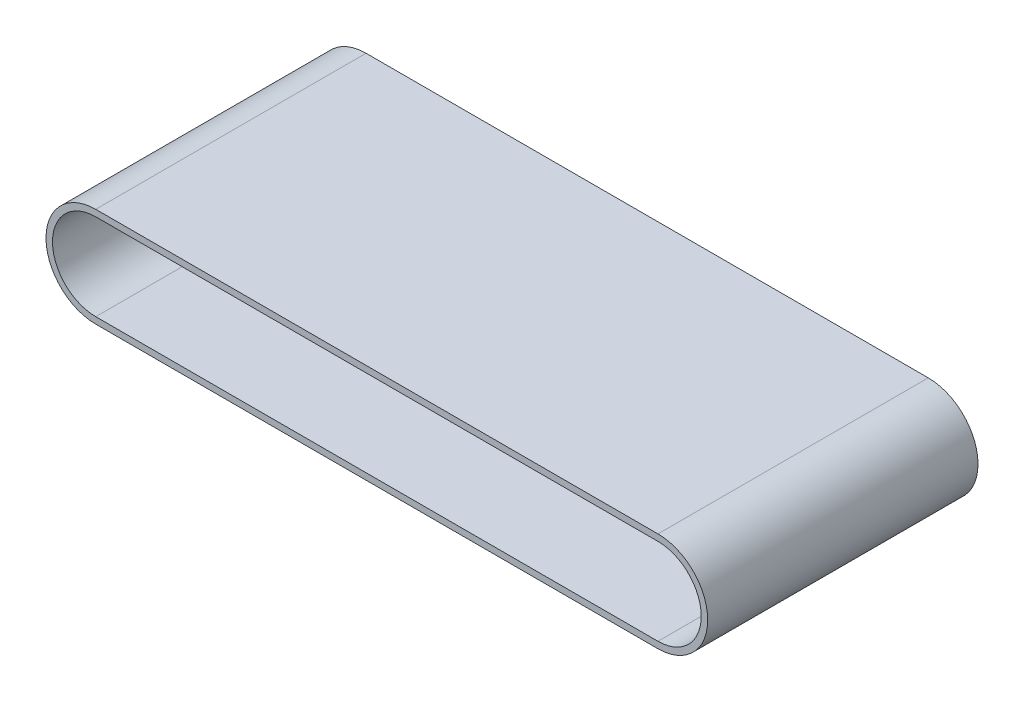
ISO-10303-21;
HEADER;
FILE_DESCRIPTION(('STEP AP214'),'2;1');
FILE_NAME('part.step','',(''),(''),'','','');
FILE_SCHEMA(('AUTOMOTIVE_DESIGN { 1 0 10303 214 1 1 1 1 }'));
ENDSEC;
DATA;
#1=APPLICATION_CONTEXT('core data for automotive mechanical design processes');
#2=APPLICATION_PROTOCOL_DEFINITION('international standard','automotive_design',2000,#1);
#3=PRODUCT_CONTEXT('',#1,'mechanical');
#4=PRODUCT('Part','Part','',(#3));
#5=PRODUCT_RELATED_PRODUCT_CATEGORY('part','',(#4));
#6=PRODUCT_DEFINITION_FORMATION('','',#4);
#7=PRODUCT_DEFINITION_CONTEXT('part definition',#1,'design');
#8=PRODUCT_DEFINITION('design','',#6,#7);
#9=PRODUCT_DEFINITION_SHAPE('','',#8);
#10=(LENGTH_UNIT() NAMED_UNIT(*) SI_UNIT(.MILLI.,.METRE.));
#11=(NAMED_UNIT(*) PLANE_ANGLE_UNIT() SI_UNIT($,.RADIAN.));
#12=(NAMED_UNIT(*) SI_UNIT($,.STERADIAN.) SOLID_ANGLE_UNIT());
#13=UNCERTAINTY_MEASURE_WITH_UNIT(LENGTH_MEASURE(1.E-05),#10,'distance_accuracy_value','');
#14=(GEOMETRIC_REPRESENTATION_CONTEXT(3) GLOBAL_UNCERTAINTY_ASSIGNED_CONTEXT((#13)) GLOBAL_UNIT_ASSIGNED_CONTEXT((#10,
#11,#12)) REPRESENTATION_CONTEXT('',''));
#15=CARTESIAN_POINT('',(0.,0.,0.));
#16=DIRECTION('',(0.,0.,1.));
#17=DIRECTION('',(1.,0.,0.));
#18=AXIS2_PLACEMENT_3D('',#15,#16,#17);
#19=CARTESIAN_POINT('',(130.,0.,125.));
#20=DIRECTION('',(0.,0.,1.));
#21=DIRECTION('',(1.,0.,0.));
#22=AXIS2_PLACEMENT_3D('',#19,#20,#21);
#23=PLANE('',#22);
#24=CARTESIAN_POINT('',(130.,0.,125.));
#25=DIRECTION('',(0.,0.,1.));
#26=DIRECTION('',(1.,0.,0.));
#27=AXIS2_PLACEMENT_3D('',#24,#25,#26);
#28=CIRCLE('',#27,23.);
#29=CARTESIAN_POINT('',(130.,-23.,125.));
#30=VERTEX_POINT('',#29);
#31=CARTESIAN_POINT('',(130.,23.,125.));
#32=VERTEX_POINT('',#31);
#33=EDGE_CURVE('E176',#30,#32,#28,.T.);
#34=ORIENTED_EDGE('',*,*,#33,.T.);
#35=DIRECTION('',(1.,0.,0.));
#36=VECTOR('',#35,1.);
#37=CARTESIAN_POINT('',(0.,23.,125.));
#38=LINE('',#37,#36);
#39=CARTESIAN_POINT('',(-130.,23.,125.));
#40=VERTEX_POINT('',#39);
#41=EDGE_CURVE('E179',#40,#32,#38,.T.);
#42=ORIENTED_EDGE('',*,*,#41,.F.);
#43=CARTESIAN_POINT('',(-130.,0.,125.));
#44=DIRECTION('',(0.,0.,1.));
#45=DIRECTION('',(1.,0.,0.));
#46=AXIS2_PLACEMENT_3D('',#43,#44,#45);
#47=CIRCLE('',#46,23.);
#48=CARTESIAN_POINT('',(-130.,-23.,125.));
#49=VERTEX_POINT('',#48);
#50=EDGE_CURVE('E184',#40,#49,#47,.T.);
#51=ORIENTED_EDGE('',*,*,#50,.T.);
#52=DIRECTION('',(1.,0.,0.));
#53=VECTOR('',#52,1.);
#54=CARTESIAN_POINT('',(0.,-23.,125.));
#55=LINE('',#54,#53);
#56=EDGE_CURVE('E187',#49,#30,#55,.T.);
#57=ORIENTED_EDGE('',*,*,#56,.T.);
#58=EDGE_LOOP('',(#34,#42,#51,#57));
#59=FACE_BOUND('',#58,.T.);
#60=DIRECTION('',(1.,0.,0.));
#61=VECTOR('',#60,1.);
#62=CARTESIAN_POINT('',(0.,20.,125.));
#63=LINE('',#62,#61);
#64=CARTESIAN_POINT('',(-130.,20.,125.));
#65=VERTEX_POINT('',#64);
#66=CARTESIAN_POINT('',(130.,20.,125.));
#67=VERTEX_POINT('',#66);
#68=EDGE_CURVE('E137',#65,#67,#63,.T.);
#69=ORIENTED_EDGE('',*,*,#68,.T.);
#70=CARTESIAN_POINT('',(130.,0.,125.));
#71=DIRECTION('',(0.,0.,1.));
#72=DIRECTION('',(1.,0.,0.));
#73=AXIS2_PLACEMENT_3D('',#70,#71,#72);
#74=CIRCLE('',#73,20.);
#75=CARTESIAN_POINT('',(130.,-20.,125.));
#76=VERTEX_POINT('',#75);
#77=EDGE_CURVE('E127',#76,#67,#74,.T.);
#78=ORIENTED_EDGE('',*,*,#77,.F.);
#79=DIRECTION('',(1.,0.,0.));
#80=VECTOR('',#79,1.);
#81=CARTESIAN_POINT('',(0.,-20.,125.));
#82=LINE('',#81,#80);
#83=CARTESIAN_POINT('',(-130.,-20.,125.));
#84=VERTEX_POINT('',#83);
#85=EDGE_CURVE('E154',#84,#76,#82,.T.);
#86=ORIENTED_EDGE('',*,*,#85,.F.);
#87=CARTESIAN_POINT('',(-130.,0.,125.));
#88=DIRECTION('',(0.,0.,1.));
#89=DIRECTION('',(1.,0.,0.));
#90=AXIS2_PLACEMENT_3D('',#87,#88,#89);
#91=CIRCLE('',#90,20.);
#92=EDGE_CURVE('E150',#65,#84,#91,.T.);
#93=ORIENTED_EDGE('',*,*,#92,.F.);
#94=EDGE_LOOP('',(#69,#78,#86,#93));
#95=FACE_BOUND('',#94,.T.);
#96=ADVANCED_FACE('F63',(#59,#95),#23,.T.);
#97=CARTESIAN_POINT('',(130.,0.,0.));
#98=DIRECTION('',(0.,0.,1.));
#99=DIRECTION('',(1.,0.,0.));
#100=AXIS2_PLACEMENT_3D('',#97,#98,#99);
#101=PLANE('',#100);
#102=CARTESIAN_POINT('',(130.,0.,0.));
#103=DIRECTION('',(0.,0.,1.));
#104=DIRECTION('',(1.,0.,0.));
#105=AXIS2_PLACEMENT_3D('',#102,#103,#104);
#106=CIRCLE('',#105,23.);
#107=CARTESIAN_POINT('',(130.,-23.,0.));
#108=VERTEX_POINT('',#107);
#109=CARTESIAN_POINT('',(130.,23.,0.));
#110=VERTEX_POINT('',#109);
#111=EDGE_CURVE('E147',#108,#110,#106,.T.);
#112=ORIENTED_EDGE('',*,*,#111,.F.);
#113=DIRECTION('',(1.,0.,0.));
#114=VECTOR('',#113,1.);
#115=CARTESIAN_POINT('',(0.,-23.,0.));
#116=LINE('',#115,#114);
#117=CARTESIAN_POINT('',(-130.,-23.,0.));
#118=VERTEX_POINT('',#117);
#119=EDGE_CURVE('E180',#118,#108,#116,.T.);
#120=ORIENTED_EDGE('',*,*,#119,.F.);
#121=CARTESIAN_POINT('',(-130.,0.,0.));
#122=DIRECTION('',(0.,0.,1.));
#123=DIRECTION('',(1.,0.,0.));
#124=AXIS2_PLACEMENT_3D('',#121,#122,#123);
#125=CIRCLE('',#124,23.);
#126=CARTESIAN_POINT('',(-130.,23.,0.));
#127=VERTEX_POINT('',#126);
#128=EDGE_CURVE('E198',#127,#118,#125,.T.);
#129=ORIENTED_EDGE('',*,*,#128,.F.);
#130=DIRECTION('',(1.,0.,0.));
#131=VECTOR('',#130,1.);
#132=CARTESIAN_POINT('',(0.,23.,0.));
#133=LINE('',#132,#131);
#134=EDGE_CURVE('E194',#127,#110,#133,.T.);
#135=ORIENTED_EDGE('',*,*,#134,.T.);
#136=EDGE_LOOP('',(#112,#120,#129,#135));
#137=FACE_BOUND('',#136,.T.);
#138=CARTESIAN_POINT('',(130.,0.,0.));
#139=DIRECTION('',(0.,0.,1.));
#140=DIRECTION('',(1.,0.,0.));
#141=AXIS2_PLACEMENT_3D('',#138,#139,#140);
#142=CIRCLE('',#141,20.);
#143=CARTESIAN_POINT('',(130.,-20.,0.));
#144=VERTEX_POINT('',#143);
#145=CARTESIAN_POINT('',(130.,20.,0.));
#146=VERTEX_POINT('',#145);
#147=EDGE_CURVE('E87',#144,#146,#142,.T.);
#148=ORIENTED_EDGE('',*,*,#147,.T.);
#149=DIRECTION('',(1.,0.,0.));
#150=VECTOR('',#149,1.);
#151=CARTESIAN_POINT('',(0.,20.,0.));
#152=LINE('',#151,#150);
#153=CARTESIAN_POINT('',(-130.,20.,0.));
#154=VERTEX_POINT('',#153);
#155=EDGE_CURVE('E145',#154,#146,#152,.T.);
#156=ORIENTED_EDGE('',*,*,#155,.F.);
#157=CARTESIAN_POINT('',(-130.,0.,0.));
#158=DIRECTION('',(0.,0.,1.));
#159=DIRECTION('',(1.,0.,0.));
#160=AXIS2_PLACEMENT_3D('',#157,#158,#159);
#161=CIRCLE('',#160,20.);
#162=CARTESIAN_POINT('',(-130.,-20.,0.));
#163=VERTEX_POINT('',#162);
#164=EDGE_CURVE('E163',#154,#163,#161,.T.);
#165=ORIENTED_EDGE('',*,*,#164,.T.);
#166=DIRECTION('',(1.,0.,0.));
#167=VECTOR('',#166,1.);
#168=CARTESIAN_POINT('',(0.,-20.,0.));
#169=LINE('',#168,#167);
#170=EDGE_CURVE('E138',#163,#144,#169,.T.);
#171=ORIENTED_EDGE('',*,*,#170,.T.);
#172=EDGE_LOOP('',(#148,#156,#165,#171));
#173=FACE_BOUND('',#172,.T.);
#174=ADVANCED_FACE('F221',(#137,#173),#101,.F.);
#175=CARTESIAN_POINT('',(130.,0.,125.));
#176=DIRECTION('',(0.,0.,-1.));
#177=DIRECTION('',(-1.,0.,0.));
#178=AXIS2_PLACEMENT_3D('',#175,#176,#177);
#179=CYLINDRICAL_SURFACE('',#178,23.);
#180=ORIENTED_EDGE('',*,*,#111,.T.);
#181=DIRECTION('',(0.,0.,-1.));
#182=VECTOR('',#181,1.);
#183=CARTESIAN_POINT('',(130.,23.,125.));
#184=LINE('',#183,#182);
#185=EDGE_CURVE('E12',#32,#110,#184,.T.);
#186=ORIENTED_EDGE('',*,*,#185,.F.);
#187=ORIENTED_EDGE('',*,*,#33,.F.);
#188=DIRECTION('',(0.,0.,-1.));
#189=VECTOR('',#188,1.);
#190=CARTESIAN_POINT('',(130.,-23.,125.));
#191=LINE('',#190,#189);
#192=EDGE_CURVE('E190',#30,#108,#191,.T.);
#193=ORIENTED_EDGE('',*,*,#192,.T.);
#194=EDGE_LOOP('',(#180,#186,#187,#193));
#195=FACE_BOUND('',#194,.T.);
#196=ADVANCED_FACE('F65',(#195),#179,.T.);
#197=CARTESIAN_POINT('',(0.,23.,125.));
#198=DIRECTION('',(0.,1.,0.));
#199=DIRECTION('',(0.,0.,1.));
#200=AXIS2_PLACEMENT_3D('',#197,#198,#199);
#201=PLANE('',#200);
#202=ORIENTED_EDGE('',*,*,#134,.F.);
#203=DIRECTION('',(0.,0.,-1.));
#204=VECTOR('',#203,1.);
#205=CARTESIAN_POINT('',(-130.,23.,125.));
#206=LINE('',#205,#204);
#207=EDGE_CURVE('E72',#40,#127,#206,.T.);
#208=ORIENTED_EDGE('',*,*,#207,.F.);
#209=ORIENTED_EDGE('',*,*,#41,.T.);
#210=ORIENTED_EDGE('',*,*,#185,.T.);
#211=EDGE_LOOP('',(#202,#208,#209,#210));
#212=FACE_BOUND('',#211,.T.);
#213=ADVANCED_FACE('F223',(#212),#201,.T.);
#214=CARTESIAN_POINT('',(-130.,0.,125.));
#215=DIRECTION('',(0.,0.,-1.));
#216=DIRECTION('',(-1.,0.,0.));
#217=AXIS2_PLACEMENT_3D('',#214,#215,#216);
#218=CYLINDRICAL_SURFACE('',#217,23.);
#219=ORIENTED_EDGE('',*,*,#128,.T.);
#220=DIRECTION('',(0.,0.,-1.));
#221=VECTOR('',#220,1.);
#222=CARTESIAN_POINT('',(-130.,-23.,125.));
#223=LINE('',#222,#221);
#224=EDGE_CURVE('E206',#49,#118,#223,.T.);
#225=ORIENTED_EDGE('',*,*,#224,.F.);
#226=ORIENTED_EDGE('',*,*,#50,.F.);
#227=ORIENTED_EDGE('',*,*,#207,.T.);
#228=EDGE_LOOP('',(#219,#225,#226,#227));
#229=FACE_BOUND('',#228,.T.);
#230=ADVANCED_FACE('F213',(#229),#218,.T.);
#231=CARTESIAN_POINT('',(0.,-23.,125.));
#232=DIRECTION('',(0.,1.,0.));
#233=DIRECTION('',(0.,0.,1.));
#234=AXIS2_PLACEMENT_3D('',#231,#232,#233);
#235=PLANE('',#234);
#236=ORIENTED_EDGE('',*,*,#119,.T.);
#237=ORIENTED_EDGE('',*,*,#192,.F.);
#238=ORIENTED_EDGE('',*,*,#56,.F.);
#239=ORIENTED_EDGE('',*,*,#224,.T.);
#240=EDGE_LOOP('',(#236,#237,#238,#239));
#241=FACE_BOUND('',#240,.T.);
#242=ADVANCED_FACE('F230',(#241),#235,.F.);
#243=CARTESIAN_POINT('',(130.,0.,125.));
#244=DIRECTION('',(0.,0.,-1.));
#245=DIRECTION('',(-1.,0.,0.));
#246=AXIS2_PLACEMENT_3D('',#243,#244,#245);
#247=CYLINDRICAL_SURFACE('',#246,20.);
#248=ORIENTED_EDGE('',*,*,#147,.F.);
#249=DIRECTION('',(0.,0.,-1.));
#250=VECTOR('',#249,1.);
#251=CARTESIAN_POINT('',(130.,-20.,125.));
#252=LINE('',#251,#250);
#253=EDGE_CURVE('E132',#76,#144,#252,.T.);
#254=ORIENTED_EDGE('',*,*,#253,.F.);
#255=ORIENTED_EDGE('',*,*,#77,.T.);
#256=DIRECTION('',(0.,0.,-1.));
#257=VECTOR('',#256,1.);
#258=CARTESIAN_POINT('',(130.,20.,125.));
#259=LINE('',#258,#257);
#260=EDGE_CURVE('E130',#67,#146,#259,.T.);
#261=ORIENTED_EDGE('',*,*,#260,.T.);
#262=EDGE_LOOP('',(#248,#254,#255,#261));
#263=FACE_BOUND('',#262,.T.);
#264=ADVANCED_FACE('F129',(#263),#247,.F.);
#265=CARTESIAN_POINT('',(0.,20.,125.));
#266=DIRECTION('',(0.,1.,0.));
#267=DIRECTION('',(0.,0.,1.));
#268=AXIS2_PLACEMENT_3D('',#265,#266,#267);
#269=PLANE('',#268);
#270=ORIENTED_EDGE('',*,*,#155,.T.);
#271=ORIENTED_EDGE('',*,*,#260,.F.);
#272=ORIENTED_EDGE('',*,*,#68,.F.);
#273=DIRECTION('',(0.,0.,-1.));
#274=VECTOR('',#273,1.);
#275=CARTESIAN_POINT('',(-130.,20.,125.));
#276=LINE('',#275,#274);
#277=EDGE_CURVE('E148',#65,#154,#276,.T.);
#278=ORIENTED_EDGE('',*,*,#277,.T.);
#279=EDGE_LOOP('',(#270,#271,#272,#278));
#280=FACE_BOUND('',#279,.T.);
#281=ADVANCED_FACE('F142',(#280),#269,.F.);
#282=CARTESIAN_POINT('',(-130.,0.,125.));
#283=DIRECTION('',(0.,0.,-1.));
#284=DIRECTION('',(-1.,0.,0.));
#285=AXIS2_PLACEMENT_3D('',#282,#283,#284);
#286=CYLINDRICAL_SURFACE('',#285,20.);
#287=ORIENTED_EDGE('',*,*,#164,.F.);
#288=ORIENTED_EDGE('',*,*,#277,.F.);
#289=ORIENTED_EDGE('',*,*,#92,.T.);
#290=DIRECTION('',(0.,0.,-1.));
#291=VECTOR('',#290,1.);
#292=CARTESIAN_POINT('',(-130.,-20.,125.));
#293=LINE('',#292,#291);
#294=EDGE_CURVE('E79',#84,#163,#293,.T.);
#295=ORIENTED_EDGE('',*,*,#294,.T.);
#296=EDGE_LOOP('',(#287,#288,#289,#295));
#297=FACE_BOUND('',#296,.T.);
#298=ADVANCED_FACE('F308',(#297),#286,.F.);
#299=CARTESIAN_POINT('',(0.,-20.,125.));
#300=DIRECTION('',(0.,1.,0.));
#301=DIRECTION('',(0.,0.,1.));
#302=AXIS2_PLACEMENT_3D('',#299,#300,#301);
#303=PLANE('',#302);
#304=ORIENTED_EDGE('',*,*,#170,.F.);
#305=ORIENTED_EDGE('',*,*,#294,.F.);
#306=ORIENTED_EDGE('',*,*,#85,.T.);
#307=ORIENTED_EDGE('',*,*,#253,.T.);
#308=EDGE_LOOP('',(#304,#305,#306,#307));
#309=FACE_BOUND('',#308,.T.);
#310=ADVANCED_FACE('F315',(#309),#303,.T.);
#311=CLOSED_SHELL('',(#96,#174,#196,#213,#230,#242,#264,#281,#298,#310));
#312=MANIFOLD_SOLID_BREP('B2',#311);
#313=ADVANCED_BREP_SHAPE_REPRESENTATION('',(#18,#312),#14);
#314=SHAPE_DEFINITION_REPRESENTATION(#9,#313);
ENDSEC;
END-ISO-10303-21;
